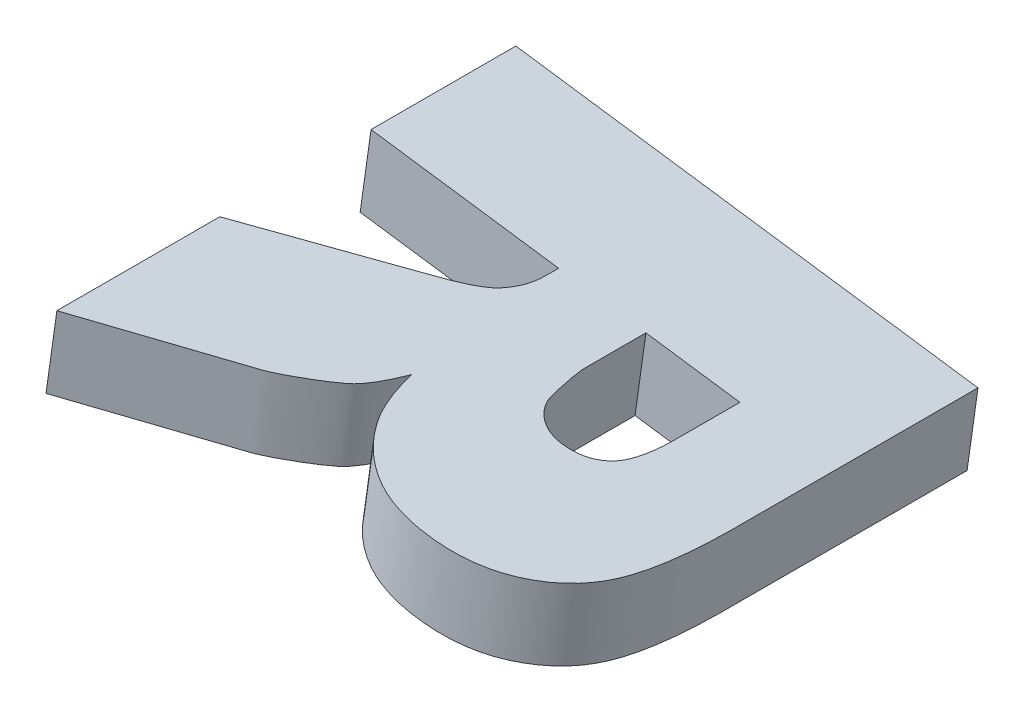
ISO-10303-21;
HEADER;
FILE_DESCRIPTION(('STEP AP214'),'2;1');
FILE_NAME('part.step','',(''),(''),'','','');
FILE_SCHEMA(('AUTOMOTIVE_DESIGN { 1 0 10303 214 1 1 1 1 }'));
ENDSEC;
DATA;
#1=APPLICATION_CONTEXT('core data for automotive mechanical design processes');
#2=APPLICATION_PROTOCOL_DEFINITION('international standard','automotive_design',2000,#1);
#3=PRODUCT_CONTEXT('',#1,'mechanical');
#4=PRODUCT('Part','Part','',(#3));
#5=PRODUCT_RELATED_PRODUCT_CATEGORY('part','',(#4));
#6=PRODUCT_DEFINITION_FORMATION('','',#4);
#7=PRODUCT_DEFINITION_CONTEXT('part definition',#1,'design');
#8=PRODUCT_DEFINITION('design','',#6,#7);
#9=PRODUCT_DEFINITION_SHAPE('','',#8);
#10=(LENGTH_UNIT() NAMED_UNIT(*) SI_UNIT(.MILLI.,.METRE.));
#11=(NAMED_UNIT(*) PLANE_ANGLE_UNIT() SI_UNIT($,.RADIAN.));
#12=(NAMED_UNIT(*) SI_UNIT($,.STERADIAN.) SOLID_ANGLE_UNIT());
#13=UNCERTAINTY_MEASURE_WITH_UNIT(LENGTH_MEASURE(1.E-05),#10,'distance_accuracy_value','');
#14=(GEOMETRIC_REPRESENTATION_CONTEXT(3) GLOBAL_UNCERTAINTY_ASSIGNED_CONTEXT((#13)) GLOBAL_UNIT_ASSIGNED_CONTEXT((#10,
#11,#12)) REPRESENTATION_CONTEXT('',''));
#15=CARTESIAN_POINT('',(0.,0.,0.));
#16=DIRECTION('',(0.,0.,1.));
#17=DIRECTION('',(1.,0.,0.));
#18=AXIS2_PLACEMENT_3D('',#15,#16,#17);
#19=CARTESIAN_POINT('',(728.175334443745,633.800061754467,2221.11236951435));
#20=DIRECTION('',(0.000106014336864278,0.000754331202662602,0.999999709872657));
#21=DIRECTION('',(0.990268068741567,-0.139173100960088,0.));
#22=AXIS2_PLACEMENT_3D('',#19,#20,#21);
#23=PLANE('',#22);
#24=CARTESIAN_POINT('',(726.783603837923,623.89738394009,2221.11998695883));
#25=CARTESIAN_POINT('',(720.744724892118,624.7460930278,2221.11998695883));
#26=CARTESIAN_POINT('',(714.705845946314,625.59480211551,2221.11998695883));
#27=B_SPLINE_CURVE_WITH_KNOTS('',2,(#24,#25,#26),.UNSPECIFIED.,.F.,.F.,(3,3),(7.,8.),.UNSPECIFIED.);
#28=CARTESIAN_POINT('',(726.783603837923,623.89738394009,2221.11998695883));
#29=VERTEX_POINT('',#28);
#30=CARTESIAN_POINT('',(714.705845946314,625.59480211551,2221.11998695883));
#31=VERTEX_POINT('',#30);
#32=EDGE_CURVE('E121',#29,#31,#27,.T.);
#33=ORIENTED_EDGE('',*,*,#32,.F.);
#34=DIRECTION('',(-0.139173060582166,-0.990267781437723,0.000761744447259827));
#35=VECTOR('',#34,1.);
#36=CARTESIAN_POINT('',(728.175334443745,633.800061754467,2221.11236951435));
#37=LINE('',#36,#35);
#38=CARTESIAN_POINT('',(728.175334443745,633.800061754467,2221.11236951435));
#39=VERTEX_POINT('',#38);
#40=EDGE_CURVE('E27',#39,#29,#37,.T.);
#41=ORIENTED_EDGE('',*,*,#40,.F.);
#42=CARTESIAN_POINT('',(728.175334443745,633.800061754467,2221.11236951435));
#43=CARTESIAN_POINT('',(722.13645549794,634.648770842177,2221.11236951435));
#44=CARTESIAN_POINT('',(716.097576552136,635.497479929888,2221.11236951435));
#45=B_SPLINE_CURVE_WITH_KNOTS('',2,(#42,#43,#44),.UNSPECIFIED.,.F.,.F.,(3,3),(7.,8.),.UNSPECIFIED.);
#46=CARTESIAN_POINT('',(716.097576552136,635.497479929888,2221.11236951435));
#47=VERTEX_POINT('',#46);
#48=EDGE_CURVE('E110',#39,#47,#45,.T.);
#49=ORIENTED_EDGE('',*,*,#48,.T.);
#50=DIRECTION('',(-0.139173060582166,-0.990267781437723,0.000761744447259827));
#51=VECTOR('',#50,1.);
#52=CARTESIAN_POINT('',(716.097576552136,635.497479929888,2221.11236951435));
#53=LINE('',#52,#51);
#54=EDGE_CURVE('E11',#47,#31,#53,.T.);
#55=ORIENTED_EDGE('',*,*,#54,.T.);
#56=EDGE_LOOP('',(#33,#41,#49,#55));
#57=FACE_BOUND('',#56,.T.);
#58=ADVANCED_FACE('F17',(#57),#23,.T.);
#59=CARTESIAN_POINT('',(680.75397522338,640.450374473134,2202.49027396215));
#60=DIRECTION('',(-0.000106014336864278,-0.000754331202662602,-0.999999709872657));
#61=DIRECTION('',(-0.990268068741567,0.139173100960088,0.));
#62=AXIS2_PLACEMENT_3D('',#59,#60,#61);
#63=PLANE('',#62);
#64=CARTESIAN_POINT('',(679.362244617559,630.547696658757,2202.49789140663));
#65=CARTESIAN_POINT('',(709.070286679806,626.372503629954,2202.49789140663));
#66=CARTESIAN_POINT('',(738.778328742053,622.197310601152,2202.49789140663));
#67=B_SPLINE_CURVE_WITH_KNOTS('',2,(#64,#65,#66),.UNSPECIFIED.,.F.,.F.,(3,3),(0.,1.),.UNSPECIFIED.);
#68=CARTESIAN_POINT('',(679.362244617559,630.547696658757,2202.49789140663));
#69=VERTEX_POINT('',#68);
#70=CARTESIAN_POINT('',(738.778328742053,622.197310601152,2202.49789140663));
#71=VERTEX_POINT('',#70);
#72=EDGE_CURVE('E97',#69,#71,#67,.T.);
#73=ORIENTED_EDGE('',*,*,#72,.F.);
#74=DIRECTION('',(-0.139173060582166,-0.990267781437723,0.000761744447259827));
#75=VECTOR('',#74,1.);
#76=CARTESIAN_POINT('',(680.75397522338,640.450374473134,2202.49027396215));
#77=LINE('',#76,#75);
#78=CARTESIAN_POINT('',(680.75397522338,640.450374473134,2202.49027396215));
#79=VERTEX_POINT('',#78);
#80=EDGE_CURVE('E92',#79,#69,#77,.T.);
#81=ORIENTED_EDGE('',*,*,#80,.F.);
#82=CARTESIAN_POINT('',(680.75397522338,640.450374473134,2202.49027396215));
#83=CARTESIAN_POINT('',(710.462017285627,636.275181444331,2202.49027396215));
#84=CARTESIAN_POINT('',(740.170059347874,632.099988415529,2202.49027396215));
#85=B_SPLINE_CURVE_WITH_KNOTS('',2,(#82,#83,#84),.UNSPECIFIED.,.F.,.F.,(3,3),(0.,1.),.UNSPECIFIED.);
#86=CARTESIAN_POINT('',(740.170059347874,632.099988415529,2202.49027396215));
#87=VERTEX_POINT('',#86);
#88=EDGE_CURVE('E95',#79,#87,#85,.T.);
#89=ORIENTED_EDGE('',*,*,#88,.T.);
#90=DIRECTION('',(-0.139173060582166,-0.990267781437723,0.000761744447259827));
#91=VECTOR('',#90,1.);
#92=CARTESIAN_POINT('',(740.170059347874,632.099988415529,2202.49027396215));
#93=LINE('',#92,#91);
#94=EDGE_CURVE('E21',#87,#71,#93,.T.);
#95=ORIENTED_EDGE('',*,*,#94,.T.);
#96=EDGE_LOOP('',(#73,#81,#89,#95));
#97=FACE_BOUND('',#96,.T.);
#98=ADVANCED_FACE('F19',(#97),#63,.T.);
#99=CARTESIAN_POINT('',(740.170059347874,632.099988415529,2202.49027396215));
#100=CARTESIAN_POINT('',(740.171697291073,632.111642986975,2217.9404741181));
#101=CARTESIAN_POINT('',(740.173335234273,632.123297558421,2233.39067427404));
#102=CARTESIAN_POINT('',(740.174246407973,632.12978089618,2241.98548760582));
#103=CARTESIAN_POINT('',(738.715670028029,632.338265032526,2246.52846036691));
#104=CARTESIAN_POINT('',(737.257093648084,632.546749168872,2251.071433128));
#105=CARTESIAN_POINT('',(733.305773277249,633.104211864591,2253.85451554019));
#106=CARTESIAN_POINT('',(729.354452906415,633.661674560309,2256.63759795239));
#107=CARTESIAN_POINT('',(723.680338460692,634.459119340708,2256.63759795239));
#108=CARTESIAN_POINT('',(718.735753015134,635.154035506484,2256.63759795239));
#109=CARTESIAN_POINT('',(715.148676338104,635.656528165676,2254.50807947064));
#110=CARTESIAN_POINT('',(711.561599661075,636.159020824867,2252.37856098888));
#111=CARTESIAN_POINT('',(709.333099965826,636.469349144144,2248.65160655343));
#112=CARTESIAN_POINT('',(707.91330782184,636.66706140352,2246.27713881636));
#113=CARTESIAN_POINT('',(706.980693374842,636.794950082575,2242.14088490044));
#114=B_SPLINE_CURVE_WITH_KNOTS('',2,(#99,#100,#101,#102,#103,#104,#105,#106,#107,#108,#109,#110,
#111,#112,#113),.UNSPECIFIED.,.F.,.F.,(3,2,2,2,2,2,2,3),(1.,2.,3.,4.,5.,6.,7.,8.),.UNSPECIFIED.);
#115=DIRECTION('',(-0.139173060582166,-0.990267781437723,0.000761744447259827));
#116=VECTOR('',#115,1.);
#117=SURFACE_OF_LINEAR_EXTRUSION('',#114,#116);
#118=CARTESIAN_POINT('',(738.778328742053,622.197310601152,2202.49789140663));
#119=CARTESIAN_POINT('',(738.779966685252,622.208965172598,2217.94809156257));
#120=CARTESIAN_POINT('',(738.781604628451,622.220619744044,2233.39829171851));
#121=CARTESIAN_POINT('',(738.782515802151,622.227103081802,2241.9931050503));
#122=CARTESIAN_POINT('',(737.323939422207,622.435587218149,2246.53607781138));
#123=CARTESIAN_POINT('',(735.865363042263,622.644071354495,2251.07905057247));
#124=CARTESIAN_POINT('',(731.914042671428,623.201534050213,2253.86213298466));
#125=CARTESIAN_POINT('',(727.962722300593,623.758996745932,2256.64521539686));
#126=CARTESIAN_POINT('',(722.288607854871,624.556441526331,2256.64521539686));
#127=CARTESIAN_POINT('',(717.344022409312,625.251357692107,2256.64521539686));
#128=CARTESIAN_POINT('',(713.756945732283,625.753850351298,2254.5156969151));
#129=CARTESIAN_POINT('',(710.169869055253,626.25634301049,2252.38617843334));
#130=CARTESIAN_POINT('',(707.941369360004,626.566671329767,2248.6592239979));
#131=CARTESIAN_POINT('',(706.521577216018,626.764383589143,2246.28475626083));
#132=CARTESIAN_POINT('',(705.58896276902,626.892272268198,2242.14850234491));
#133=B_SPLINE_CURVE_WITH_KNOTS('',2,(#118,#119,#120,#121,#122,#123,#124,#125,#126,#127,#128,
#129,#130,#131,#132),.UNSPECIFIED.,.F.,.F.,(3,2,2,2,2,2,2,3),(1.,2.,3.,4.,5.,6.,7.,8.),.UNSPECIFIED.);
#134=CARTESIAN_POINT('',(705.58896276902,626.892272268198,2242.14850234491));
#135=VERTEX_POINT('',#134);
#136=EDGE_CURVE('E271',#71,#135,#133,.T.);
#137=ORIENTED_EDGE('',*,*,#136,.F.);
#138=ORIENTED_EDGE('',*,*,#94,.F.);
#139=CARTESIAN_POINT('',(706.980693374842,636.794950082575,2242.14088490044));
#140=VERTEX_POINT('',#139);
#141=EDGE_CURVE('E116',#87,#140,#114,.T.);
#142=ORIENTED_EDGE('',*,*,#141,.T.);
#143=DIRECTION('',(-0.139173060582166,-0.990267781437723,0.000761744447259827));
#144=VECTOR('',#143,1.);
#145=CARTESIAN_POINT('',(706.980693374842,636.794950082575,2242.14088490044));
#146=LINE('',#145,#144);
#147=EDGE_CURVE('E268',#140,#135,#146,.T.);
#148=ORIENTED_EDGE('',*,*,#147,.T.);
#149=EDGE_LOOP('',(#137,#138,#142,#148));
#150=FACE_BOUND('',#149,.T.);
#151=ADVANCED_FACE('F139',(#150),#117,.T.);
#152=CARTESIAN_POINT('',(706.980693374842,636.794950082575,2242.14088490044));
#153=CARTESIAN_POINT('',(705.885484512723,636.951419792004,2245.4534692054));
#154=CARTESIAN_POINT('',(704.794430178865,637.105923946832,2246.96987765948));
#155=CARTESIAN_POINT('',(704.060664346505,637.209832493136,2247.98970653233));
#156=CARTESIAN_POINT('',(701.667419913789,637.547675514072,2249.93249246253));
#157=CARTESIAN_POINT('',(699.274175481072,637.885518535009,2251.87527839274));
#158=CARTESIAN_POINT('',(697.984020967997,638.067353219313,2252.54515817715));
#159=CARTESIAN_POINT('',(689.368134898675,639.281678253673,2257.01873699597));
#160=CARTESIAN_POINT('',(680.760231949455,640.494893392407,2261.50799217374));
#161=B_SPLINE_CURVE_WITH_KNOTS('',2,(#152,#153,#154,#155,#156,#157,#158,#159,#160),
.UNSPECIFIED.,.F.,.F.,(3,2,2,2,3),(8.,9.,10.,11.,12.),.UNSPECIFIED.);
#162=DIRECTION('',(-0.139173060582166,-0.990267781437723,0.000761744447259827));
#163=VECTOR('',#162,1.);
#164=SURFACE_OF_LINEAR_EXTRUSION('',#161,#163);
#165=CARTESIAN_POINT('',(705.58896276902,626.892272268198,2242.14850234491));
#166=CARTESIAN_POINT('',(704.493753906901,627.048741977627,2245.46108664987));
#167=CARTESIAN_POINT('',(703.402699573043,627.203246132454,2246.97749510395));
#168=CARTESIAN_POINT('',(702.668933740684,627.307154678759,2247.9973239768));
#169=CARTESIAN_POINT('',(700.275689307967,627.644997699695,2249.940109907));
#170=CARTESIAN_POINT('',(697.88244487525,627.982840720632,2251.88289583721));
#171=CARTESIAN_POINT('',(696.592290362175,628.164675404936,2252.55277562162));
#172=CARTESIAN_POINT('',(687.976404292853,629.379000439295,2257.02635444044));
#173=CARTESIAN_POINT('',(679.368501343633,630.59221557803,2261.51560961821));
#174=B_SPLINE_CURVE_WITH_KNOTS('',2,(#165,#166,#167,#168,#169,#170,#171,#172,#173),
.UNSPECIFIED.,.F.,.F.,(3,2,2,2,3),(8.,9.,10.,11.,12.),.UNSPECIFIED.);
#175=CARTESIAN_POINT('',(679.368501343633,630.59221557803,2261.51560961821));
#176=VERTEX_POINT('',#175);
#177=EDGE_CURVE('E228',#135,#176,#174,.T.);
#178=ORIENTED_EDGE('',*,*,#177,.F.);
#179=ORIENTED_EDGE('',*,*,#147,.F.);
#180=CARTESIAN_POINT('',(680.760231949455,640.494893392407,2261.50799217374));
#181=VERTEX_POINT('',#180);
#182=EDGE_CURVE('E119',#140,#181,#161,.T.);
#183=ORIENTED_EDGE('',*,*,#182,.T.);
#184=DIRECTION('',(-0.139173060582166,-0.990267781437723,0.000761744447259827));
#185=VECTOR('',#184,1.);
#186=CARTESIAN_POINT('',(680.760231949455,640.494893392407,2261.50799217374));
#187=LINE('',#186,#185);
#188=EDGE_CURVE('E267',#181,#176,#187,.T.);
#189=ORIENTED_EDGE('',*,*,#188,.T.);
#190=EDGE_LOOP('',(#178,#179,#183,#189));
#191=FACE_BOUND('',#190,.T.);
#192=ADVANCED_FACE('F142',(#191),#164,.T.);
#193=CARTESIAN_POINT('',(680.760231949455,640.494893392407,2261.50799217374));
#194=DIRECTION('',(-0.990268068741567,0.139173100960088,0.));
#195=DIRECTION('',(0.00010601433685903,0.000754331202663339,0.999999709872657));
#196=AXIS2_PLACEMENT_3D('',#193,#194,#195);
#197=PLANE('',#196);
#198=CARTESIAN_POINT('',(679.368501343633,630.59221557803,2261.51560961821));
#199=CARTESIAN_POINT('',(679.367390884584,630.584314251333,2251.04100061761));
#200=CARTESIAN_POINT('',(679.366280425535,630.576412924635,2240.56639161703));
#201=B_SPLINE_CURVE_WITH_KNOTS('',2,(#198,#199,#200),.UNSPECIFIED.,.F.,.F.,(3,3),(12.,13.),.UNSPECIFIED.);
#202=CARTESIAN_POINT('',(679.366280425535,630.576412924635,2240.56639161703));
#203=VERTEX_POINT('',#202);
#204=EDGE_CURVE('E226',#176,#203,#201,.T.);
#205=ORIENTED_EDGE('',*,*,#204,.F.);
#206=ORIENTED_EDGE('',*,*,#188,.F.);
#207=CARTESIAN_POINT('',(680.760231949455,640.494893392407,2261.50799217374));
#208=CARTESIAN_POINT('',(680.759121490406,640.48699206571,2251.03338317315));
#209=CARTESIAN_POINT('',(680.758011031356,640.479090739013,2240.55877417255));
#210=B_SPLINE_CURVE_WITH_KNOTS('',2,(#207,#208,#209),.UNSPECIFIED.,.F.,.F.,(3,3),(12.,13.),.UNSPECIFIED.);
#211=CARTESIAN_POINT('',(680.758011031356,640.479090739013,2240.55877417255));
#212=VERTEX_POINT('',#211);
#213=EDGE_CURVE('E163',#181,#212,#210,.T.);
#214=ORIENTED_EDGE('',*,*,#213,.T.);
#215=DIRECTION('',(-0.139173060582166,-0.990267781437723,0.000761744447259827));
#216=VECTOR('',#215,1.);
#217=CARTESIAN_POINT('',(680.758011031356,640.479090739013,2240.55877417255));
#218=LINE('',#217,#216);
#219=EDGE_CURVE('E265',#212,#203,#218,.T.);
#220=ORIENTED_EDGE('',*,*,#219,.T.);
#221=EDGE_LOOP('',(#205,#206,#214,#220));
#222=FACE_BOUND('',#221,.T.);
#223=ADVANCED_FACE('F145',(#222),#197,.T.);
#224=CARTESIAN_POINT('',(680.758011031356,640.479090739013,2240.55877417255));
#225=CARTESIAN_POINT('',(689.836068829824,639.199441282144,2235.60364685846));
#226=CARTESIAN_POINT('',(698.926576899026,637.918060053195,2230.6719187147));
#227=CARTESIAN_POINT('',(702.439983871989,637.422816694899,2228.76584614789));
#228=CARTESIAN_POINT('',(703.477678348452,637.275836139999,2227.28110703191));
#229=CARTESIAN_POINT('',(704.871378397468,637.078430438017,2225.28699313264));
#230=CARTESIAN_POINT('',(704.87110938428,637.076516309726,2222.74947681565));
#231=CARTESIAN_POINT('',(704.871022605832,637.075898848987,2221.93092316499));
#232=CARTESIAN_POINT('',(704.870935827385,637.075281388248,2221.11236951435));
#233=B_SPLINE_CURVE_WITH_KNOTS('',2,(#224,#225,#226,#227,#228,#229,#230,#231,#232),
.UNSPECIFIED.,.F.,.F.,(3,2,2,2,3),(13.,14.,15.,16.,17.),.UNSPECIFIED.);
#234=DIRECTION('',(-0.139173060582166,-0.990267781437723,0.000761744447259827));
#235=VECTOR('',#234,1.);
#236=SURFACE_OF_LINEAR_EXTRUSION('',#233,#235);
#237=CARTESIAN_POINT('',(679.366280425535,630.576412924635,2240.56639161703));
#238=CARTESIAN_POINT('',(688.444338224002,629.296763467767,2235.61126430294));
#239=CARTESIAN_POINT('',(697.534846293205,628.015382238818,2230.67953615918));
#240=CARTESIAN_POINT('',(701.048253266167,627.520138880522,2228.77346359237));
#241=CARTESIAN_POINT('',(702.08594774263,627.373158325621,2227.28872447639));
#242=CARTESIAN_POINT('',(703.479647791646,627.175752623639,2225.29461057712));
#243=CARTESIAN_POINT('',(703.479378778458,627.173838495349,2222.75709426012));
#244=CARTESIAN_POINT('',(703.479292000011,627.17322103461,2221.93854060947));
#245=CARTESIAN_POINT('',(703.479205221563,627.172603573871,2221.11998695883));
#246=B_SPLINE_CURVE_WITH_KNOTS('',2,(#237,#238,#239,#240,#241,#242,#243,#244,#245),
.UNSPECIFIED.,.F.,.F.,(3,2,2,2,3),(13.,14.,15.,16.,17.),.UNSPECIFIED.);
#247=CARTESIAN_POINT('',(703.479205221563,627.172603573871,2221.11998695883));
#248=VERTEX_POINT('',#247);
#249=EDGE_CURVE('E219',#203,#248,#246,.T.);
#250=ORIENTED_EDGE('',*,*,#249,.F.);
#251=ORIENTED_EDGE('',*,*,#219,.F.);
#252=CARTESIAN_POINT('',(704.870935827385,637.075281388248,2221.11236951435));
#253=VERTEX_POINT('',#252);
#254=EDGE_CURVE('E157',#212,#253,#233,.T.);
#255=ORIENTED_EDGE('',*,*,#254,.T.);
#256=DIRECTION('',(-0.139173060582166,-0.990267781437723,0.000761744447259827));
#257=VECTOR('',#256,1.);
#258=CARTESIAN_POINT('',(704.870935827385,637.075281388248,2221.11236951435));
#259=LINE('',#258,#257);
#260=EDGE_CURVE('E216',#253,#248,#259,.T.);
#261=ORIENTED_EDGE('',*,*,#260,.T.);
#262=EDGE_LOOP('',(#250,#251,#255,#261));
#263=FACE_BOUND('',#262,.T.);
#264=ADVANCED_FACE('F149',(#263),#236,.T.);
#265=CARTESIAN_POINT('',(704.870935827385,637.075281388248,2221.11236951435));
#266=DIRECTION('',(0.000106014336864278,0.000754331202662602,0.999999709872657));
#267=DIRECTION('',(0.990268068741567,-0.139173100960088,0.));
#268=AXIS2_PLACEMENT_3D('',#265,#266,#267);
#269=PLANE('',#268);
#270=CARTESIAN_POINT('',(703.479205221563,627.172603573871,2221.11998695883));
#271=CARTESIAN_POINT('',(691.421712024403,628.867173732219,2221.11998695883));
#272=CARTESIAN_POINT('',(679.364218827242,630.561743890566,2221.11998695883));
#273=B_SPLINE_CURVE_WITH_KNOTS('',2,(#270,#271,#272),.UNSPECIFIED.,.F.,.F.,(3,3),(17.,18.),.UNSPECIFIED.);
#274=CARTESIAN_POINT('',(679.364218827242,630.561743890566,2221.11998695883));
#275=VERTEX_POINT('',#274);
#276=EDGE_CURVE('E214',#248,#275,#273,.T.);
#277=ORIENTED_EDGE('',*,*,#276,.F.);
#278=ORIENTED_EDGE('',*,*,#260,.F.);
#279=CARTESIAN_POINT('',(704.870935827385,637.075281388248,2221.11236951435));
#280=CARTESIAN_POINT('',(692.813442630224,638.769851546596,2221.11236951435));
#281=CARTESIAN_POINT('',(680.755949433064,640.464421704943,2221.11236951435));
#282=B_SPLINE_CURVE_WITH_KNOTS('',2,(#279,#280,#281),.UNSPECIFIED.,.F.,.F.,(3,3),(17.,18.),.UNSPECIFIED.);
#283=CARTESIAN_POINT('',(680.755949433064,640.464421704943,2221.11236951435));
#284=VERTEX_POINT('',#283);
#285=EDGE_CURVE('E111',#253,#284,#282,.T.);
#286=ORIENTED_EDGE('',*,*,#285,.T.);
#287=DIRECTION('',(-0.139173060582166,-0.990267781437723,0.000761744447259827));
#288=VECTOR('',#287,1.);
#289=CARTESIAN_POINT('',(680.755949433064,640.464421704943,2221.11236951435));
#290=LINE('',#289,#288);
#291=EDGE_CURVE('E101',#284,#275,#290,.T.);
#292=ORIENTED_EDGE('',*,*,#291,.T.);
#293=EDGE_LOOP('',(#277,#278,#286,#292));
#294=FACE_BOUND('',#293,.T.);
#295=ADVANCED_FACE('F154',(#294),#269,.T.);
#296=CARTESIAN_POINT('',(680.755949433064,640.464421704943,2221.11236951435));
#297=DIRECTION('',(-0.990268068741567,0.139173100960088,0.));
#298=DIRECTION('',(0.000106014336864278,0.000754331202662602,0.999999709872657));
#299=AXIS2_PLACEMENT_3D('',#296,#297,#298);
#300=PLANE('',#299);
#301=CARTESIAN_POINT('',(679.364218827242,630.561743890566,2221.11998695883));
#302=CARTESIAN_POINT('',(679.3632317224,630.554720274662,2211.80893918272));
#303=CARTESIAN_POINT('',(679.362244617559,630.547696658757,2202.49789140663));
#304=B_SPLINE_CURVE_WITH_KNOTS('',2,(#301,#302,#303),.UNSPECIFIED.,.F.,.F.,(3,3),(18.,19.),.UNSPECIFIED.);
#305=EDGE_CURVE('E218',#275,#69,#304,.T.);
#306=ORIENTED_EDGE('',*,*,#305,.F.);
#307=ORIENTED_EDGE('',*,*,#291,.F.);
#308=CARTESIAN_POINT('',(680.755949433064,640.464421704943,2221.11236951435));
#309=CARTESIAN_POINT('',(680.754962328222,640.457398089039,2211.80132173825));
#310=CARTESIAN_POINT('',(680.75397522338,640.450374473134,2202.49027396215));
#311=B_SPLINE_CURVE_WITH_KNOTS('',2,(#308,#309,#310),.UNSPECIFIED.,.F.,.F.,(3,3),(18.,19.),.UNSPECIFIED.);
#312=EDGE_CURVE('E105',#284,#79,#311,.T.);
#313=ORIENTED_EDGE('',*,*,#312,.T.);
#314=ORIENTED_EDGE('',*,*,#80,.T.);
#315=EDGE_LOOP('',(#306,#307,#313,#314));
#316=FACE_BOUND('',#315,.T.);
#317=ADVANCED_FACE('F106',(#316),#300,.T.);
#318=CARTESIAN_POINT('',(716.097576552136,635.497479929888,2221.11236951435));
#319=CARTESIAN_POINT('',(716.097990919223,635.500428304916,2225.02096319619));
#320=CARTESIAN_POINT('',(716.09840528631,635.503376679944,2228.92955687802));
#321=CARTESIAN_POINT('',(716.098539792904,635.504333744089,2230.19831503652));
#322=CARTESIAN_POINT('',(716.880910744262,635.397185458248,2233.84712995903));
#323=CARTESIAN_POINT('',(717.274473486546,635.343285740814,2235.68262449585));
#324=CARTESIAN_POINT('',(718.774184535061,635.133412358976,2236.84906344802));
#325=CARTESIAN_POINT('',(720.273895583575,634.923538977138,2238.01550240019));
#326=CARTESIAN_POINT('',(722.21930625068,634.650129338144,2238.01550240019));
#327=CARTESIAN_POINT('',(725.096892862439,634.245710913799,2238.01550240019));
#328=CARTESIAN_POINT('',(726.636814389057,634.0278723296,2236.17375668624));
#329=CARTESIAN_POINT('',(728.176735915674,633.8100337454,2234.33201097228));
#330=CARTESIAN_POINT('',(728.176197889299,633.806205488819,2229.25697833828));
#331=CARTESIAN_POINT('',(728.175766166522,633.803133621643,2225.18467392631));
#332=CARTESIAN_POINT('',(728.175334443745,633.800061754467,2221.11236951435));
#333=B_SPLINE_CURVE_WITH_KNOTS('',2,(#318,#319,#320,#321,#322,#323,#324,#325,#326,#327,#328,
#329,#330,#331,#332),.UNSPECIFIED.,.F.,.F.,(3,2,2,2,2,2,2,3),(0.,1.,2.,3.,4.,5.,6.,7.),.UNSPECIFIED.);
#334=DIRECTION('',(-0.139173060582166,-0.990267781437723,0.000761744447259827));
#335=VECTOR('',#334,1.);
#336=SURFACE_OF_LINEAR_EXTRUSION('',#333,#335);
#337=CARTESIAN_POINT('',(714.705845946314,625.59480211551,2221.11998695883));
#338=CARTESIAN_POINT('',(714.706260313401,625.597750490539,2225.02858064066));
#339=CARTESIAN_POINT('',(714.706674680489,625.600698865567,2228.93717432249));
#340=CARTESIAN_POINT('',(714.706809187083,625.601655929712,2230.20593248099));
#341=CARTESIAN_POINT('',(715.489180138441,625.494507643871,2233.8547474035));
#342=CARTESIAN_POINT('',(715.882742880724,625.440607926437,2235.69024194032));
#343=CARTESIAN_POINT('',(717.382453929239,625.230734544599,2236.85668089249));
#344=CARTESIAN_POINT('',(718.882164977753,625.020861162761,2238.02311984466));
#345=CARTESIAN_POINT('',(720.827575644858,624.747451523767,2238.02311984466));
#346=CARTESIAN_POINT('',(723.705162256618,624.343033099422,2238.02311984466));
#347=CARTESIAN_POINT('',(725.245083783235,624.125194515222,2236.18137413071));
#348=CARTESIAN_POINT('',(726.785005309852,623.907355931023,2234.33962841676));
#349=CARTESIAN_POINT('',(726.784467283477,623.903527674442,2229.26459578275));
#350=CARTESIAN_POINT('',(726.7840355607,623.900455807266,2225.19229137078));
#351=CARTESIAN_POINT('',(726.783603837923,623.89738394009,2221.11998695883));
#352=B_SPLINE_CURVE_WITH_KNOTS('',2,(#337,#338,#339,#340,#341,#342,#343,#344,#345,#346,#347,
#348,#349,#350,#351),.UNSPECIFIED.,.F.,.F.,(3,2,2,2,2,2,2,3),(0.,1.,2.,3.,4.,5.,6.,7.),.UNSPECIFIED.);
#353=EDGE_CURVE('E117',#31,#29,#352,.T.);
#354=ORIENTED_EDGE('',*,*,#353,.F.);
#355=ORIENTED_EDGE('',*,*,#54,.F.);
#356=EDGE_CURVE('E102',#47,#39,#333,.T.);
#357=ORIENTED_EDGE('',*,*,#356,.T.);
#358=ORIENTED_EDGE('',*,*,#40,.T.);
#359=EDGE_LOOP('',(#354,#355,#357,#358));
#360=FACE_BOUND('',#359,.T.);
#361=ADVANCED_FACE('F197',(#360),#336,.T.);
#362=CARTESIAN_POINT('',(728.923754387693,633.721670081479,2255.94182734934));
#363=DIRECTION('',(0.139173060582453,0.990267781437683,-0.000761744447252642));
#364=DIRECTION('',(-0.990268068741527,0.139173100960375,0.));
#365=AXIS2_PLACEMENT_3D('',#362,#363,#364);
#366=PLANE('',#365);
#367=ORIENTED_EDGE('',*,*,#88,.F.);
#368=ORIENTED_EDGE('',*,*,#312,.F.);
#369=ORIENTED_EDGE('',*,*,#285,.F.);
#370=ORIENTED_EDGE('',*,*,#254,.F.);
#371=ORIENTED_EDGE('',*,*,#213,.F.);
#372=ORIENTED_EDGE('',*,*,#182,.F.);
#373=ORIENTED_EDGE('',*,*,#141,.F.);
#374=EDGE_LOOP('',(#367,#368,#369,#370,#371,#372,#373));
#375=FACE_BOUND('',#374,.T.);
#376=ORIENTED_EDGE('',*,*,#48,.F.);
#377=ORIENTED_EDGE('',*,*,#356,.F.);
#378=EDGE_LOOP('',(#376,#377));
#379=FACE_BOUND('',#378,.T.);
#380=ADVANCED_FACE('F113',(#375,#379),#366,.T.);
#381=CARTESIAN_POINT('',(727.532023781871,623.818992267102,2255.94944479382));
#382=DIRECTION('',(0.139173060582453,0.990267781437683,-0.000761744447252642));
#383=DIRECTION('',(-0.990268068741527,0.139173100960375,0.));
#384=AXIS2_PLACEMENT_3D('',#381,#382,#383);
#385=PLANE('',#384);
#386=ORIENTED_EDGE('',*,*,#72,.T.);
#387=ORIENTED_EDGE('',*,*,#136,.T.);
#388=ORIENTED_EDGE('',*,*,#177,.T.);
#389=ORIENTED_EDGE('',*,*,#204,.T.);
#390=ORIENTED_EDGE('',*,*,#249,.T.);
#391=ORIENTED_EDGE('',*,*,#276,.T.);
#392=ORIENTED_EDGE('',*,*,#305,.T.);
#393=EDGE_LOOP('',(#386,#387,#388,#389,#390,#391,#392));
#394=FACE_BOUND('',#393,.T.);
#395=ORIENTED_EDGE('',*,*,#32,.T.);
#396=ORIENTED_EDGE('',*,*,#353,.T.);
#397=EDGE_LOOP('',(#395,#396));
#398=FACE_BOUND('',#397,.T.);
#399=ADVANCED_FACE('F201',(#394,#398),#385,.F.);
#400=CLOSED_SHELL('',(#58,#98,#151,#192,#223,#264,#295,#317,#361,#380,#399));
#401=MANIFOLD_SOLID_BREP('B1',#400);
#402=ADVANCED_BREP_SHAPE_REPRESENTATION('',(#18,#401),#14);
#403=SHAPE_DEFINITION_REPRESENTATION(#9,#402);
ENDSEC;
END-ISO-10303-21;
